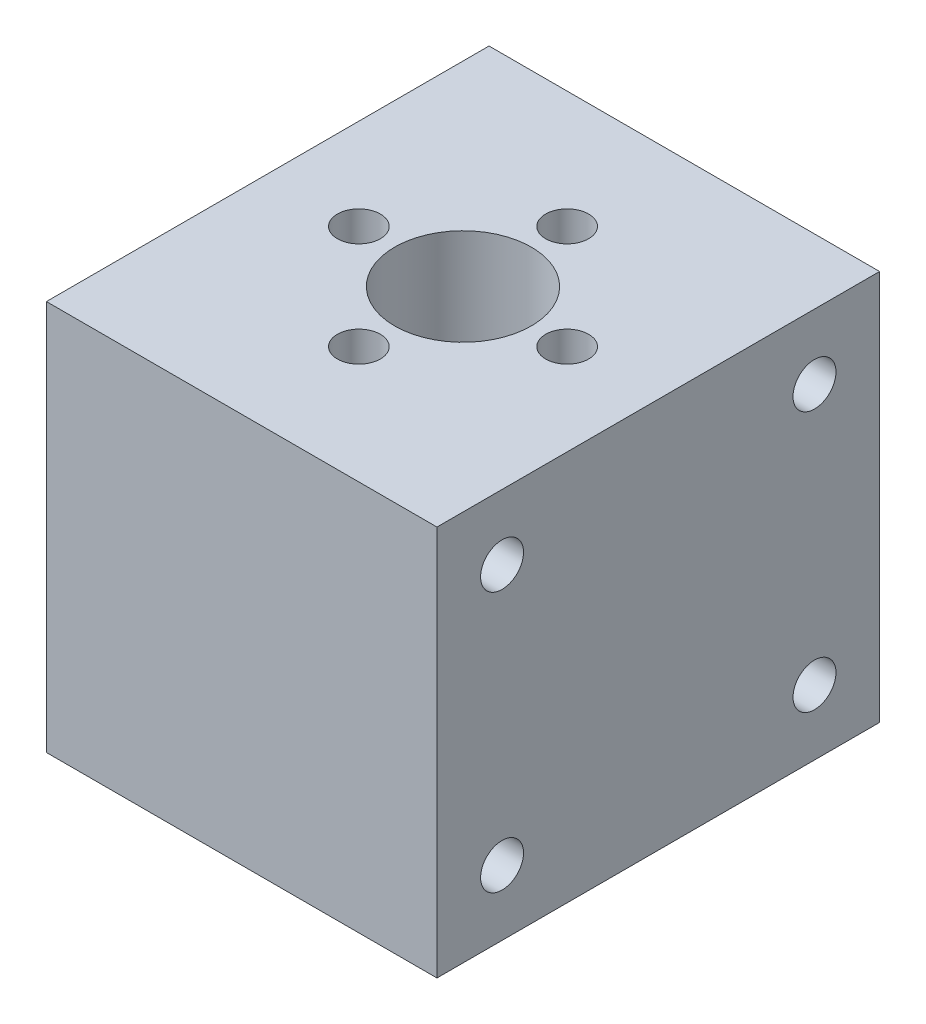
ISO-10303-21;
HEADER;
FILE_DESCRIPTION(('STEP AP214'),'2;1');
FILE_NAME('part.step','',(''),(''),'','','');
FILE_SCHEMA(('AUTOMOTIVE_DESIGN { 1 0 10303 214 1 1 1 1 }'));
ENDSEC;
DATA;
#1=APPLICATION_CONTEXT('core data for automotive mechanical design processes');
#2=APPLICATION_PROTOCOL_DEFINITION('international standard','automotive_design',2000,#1);
#3=PRODUCT_CONTEXT('',#1,'mechanical');
#4=PRODUCT('Part','Part','',(#3));
#5=PRODUCT_RELATED_PRODUCT_CATEGORY('part','',(#4));
#6=PRODUCT_DEFINITION_FORMATION('','',#4);
#7=PRODUCT_DEFINITION_CONTEXT('part definition',#1,'design');
#8=PRODUCT_DEFINITION('design','',#6,#7);
#9=PRODUCT_DEFINITION_SHAPE('','',#8);
#10=(LENGTH_UNIT() NAMED_UNIT(*) SI_UNIT(.MILLI.,.METRE.));
#11=(NAMED_UNIT(*) PLANE_ANGLE_UNIT() SI_UNIT($,.RADIAN.));
#12=(NAMED_UNIT(*) SI_UNIT($,.STERADIAN.) SOLID_ANGLE_UNIT());
#13=UNCERTAINTY_MEASURE_WITH_UNIT(LENGTH_MEASURE(1.E-05),#10,'distance_accuracy_value','');
#14=(GEOMETRIC_REPRESENTATION_CONTEXT(3) GLOBAL_UNCERTAINTY_ASSIGNED_CONTEXT((#13)) GLOBAL_UNIT_ASSIGNED_CONTEXT((#10,
#11,#12)) REPRESENTATION_CONTEXT('',''));
#15=CARTESIAN_POINT('',(0.,0.,0.));
#16=DIRECTION('',(0.,0.,1.));
#17=DIRECTION('',(1.,0.,0.));
#18=AXIS2_PLACEMENT_3D('',#15,#16,#17);
#19=CARTESIAN_POINT('',(0.,30.,0.));
#20=DIRECTION('',(1.,0.,0.));
#21=DIRECTION('',(0.,0.,-1.));
#22=AXIS2_PLACEMENT_3D('',#19,#20,#21);
#23=PLANE('',#22);
#24=DIRECTION('',(0.,0.,1.));
#25=VECTOR('',#24,1.);
#26=CARTESIAN_POINT('',(0.,0.,0.));
#27=LINE('',#26,#25);
#28=CARTESIAN_POINT('',(0.,0.,-34.));
#29=VERTEX_POINT('',#28);
#30=CARTESIAN_POINT('',(0.,0.,0.));
#31=VERTEX_POINT('',#30);
#32=EDGE_CURVE('E102',#29,#31,#27,.T.);
#33=ORIENTED_EDGE('',*,*,#32,.T.);
#34=DIRECTION('',(0.,-1.,0.));
#35=VECTOR('',#34,1.);
#36=CARTESIAN_POINT('',(0.,30.,0.));
#37=LINE('',#36,#35);
#38=CARTESIAN_POINT('',(0.,30.,0.));
#39=VERTEX_POINT('',#38);
#40=EDGE_CURVE('E11',#39,#31,#37,.T.);
#41=ORIENTED_EDGE('',*,*,#40,.F.);
#42=DIRECTION('',(0.,0.,1.));
#43=VECTOR('',#42,1.);
#44=CARTESIAN_POINT('',(0.,30.,0.));
#45=LINE('',#44,#43);
#46=CARTESIAN_POINT('',(0.,30.,-34.));
#47=VERTEX_POINT('',#46);
#48=EDGE_CURVE('E90',#47,#39,#45,.T.);
#49=ORIENTED_EDGE('',*,*,#48,.F.);
#50=DIRECTION('',(0.,-1.,0.));
#51=VECTOR('',#50,1.);
#52=CARTESIAN_POINT('',(0.,30.,-34.));
#53=LINE('',#52,#51);
#54=EDGE_CURVE('E98',#47,#29,#53,.T.);
#55=ORIENTED_EDGE('',*,*,#54,.T.);
#56=EDGE_LOOP('',(#33,#41,#49,#55));
#57=FACE_BOUND('',#56,.T.);
#58=ADVANCED_FACE('F39',(#57),#23,.F.);
#59=CARTESIAN_POINT('',(0.,30.,0.));
#60=DIRECTION('',(0.,0.,-1.));
#61=DIRECTION('',(-1.,0.,0.));
#62=AXIS2_PLACEMENT_3D('',#59,#60,#61);
#63=PLANE('',#62);
#64=DIRECTION('',(1.,0.,0.));
#65=VECTOR('',#64,1.);
#66=CARTESIAN_POINT('',(0.,0.,0.));
#67=LINE('',#66,#65);
#68=CARTESIAN_POINT('',(30.,0.,0.));
#69=VERTEX_POINT('',#68);
#70=EDGE_CURVE('E94',#31,#69,#67,.T.);
#71=ORIENTED_EDGE('',*,*,#70,.T.);
#72=DIRECTION('',(0.,-1.,0.));
#73=VECTOR('',#72,1.);
#74=CARTESIAN_POINT('',(30.,30.,0.));
#75=LINE('',#74,#73);
#76=CARTESIAN_POINT('',(30.,30.,0.));
#77=VERTEX_POINT('',#76);
#78=EDGE_CURVE('E47',#77,#69,#75,.T.);
#79=ORIENTED_EDGE('',*,*,#78,.F.);
#80=DIRECTION('',(1.,0.,0.));
#81=VECTOR('',#80,1.);
#82=CARTESIAN_POINT('',(0.,30.,0.));
#83=LINE('',#82,#81);
#84=EDGE_CURVE('E85',#39,#77,#83,.T.);
#85=ORIENTED_EDGE('',*,*,#84,.F.);
#86=ORIENTED_EDGE('',*,*,#40,.T.);
#87=EDGE_LOOP('',(#71,#79,#85,#86));
#88=FACE_BOUND('',#87,.T.);
#89=ADVANCED_FACE('F93',(#88),#63,.F.);
#90=CARTESIAN_POINT('',(30.,30.,0.));
#91=DIRECTION('',(-1.,0.,0.));
#92=DIRECTION('',(0.,0.,1.));
#93=AXIS2_PLACEMENT_3D('',#90,#91,#92);
#94=PLANE('',#93);
#95=CARTESIAN_POINT('',(30.,25.,-5.));
#96=DIRECTION('',(1.,0.,0.));
#97=DIRECTION('',(0.,0.,-1.));
#98=AXIS2_PLACEMENT_3D('',#95,#96,#97);
#99=CIRCLE('',#98,1.65000000000002);
#100=CARTESIAN_POINT('',(30.,25.,-6.65000000000002));
#101=VERTEX_POINT('',#100);
#102=EDGE_CURVE('E136',#101,#101,#99,.T.);
#103=ORIENTED_EDGE('',*,*,#102,.F.);
#104=EDGE_LOOP('',(#103));
#105=FACE_BOUND('',#104,.T.);
#106=CARTESIAN_POINT('',(30.,25.,-29.));
#107=DIRECTION('',(1.,0.,0.));
#108=DIRECTION('',(0.,0.,-1.));
#109=AXIS2_PLACEMENT_3D('',#106,#107,#108);
#110=CIRCLE('',#109,1.65000000000002);
#111=CARTESIAN_POINT('',(30.,25.,-30.65));
#112=VERTEX_POINT('',#111);
#113=EDGE_CURVE('E130',#112,#112,#110,.T.);
#114=ORIENTED_EDGE('',*,*,#113,.F.);
#115=EDGE_LOOP('',(#114));
#116=FACE_BOUND('',#115,.T.);
#117=CARTESIAN_POINT('',(30.,5.,-5.));
#118=DIRECTION('',(1.,0.,0.));
#119=DIRECTION('',(0.,0.,-1.));
#120=AXIS2_PLACEMENT_3D('',#117,#118,#119);
#121=CIRCLE('',#120,1.65000000000001);
#122=CARTESIAN_POINT('',(30.,5.,-6.65000000000001));
#123=VERTEX_POINT('',#122);
#124=EDGE_CURVE('E124',#123,#123,#121,.T.);
#125=ORIENTED_EDGE('',*,*,#124,.F.);
#126=EDGE_LOOP('',(#125));
#127=FACE_BOUND('',#126,.T.);
#128=CARTESIAN_POINT('',(30.,5.,-29.));
#129=DIRECTION('',(1.,0.,0.));
#130=DIRECTION('',(0.,0.,-1.));
#131=AXIS2_PLACEMENT_3D('',#128,#129,#130);
#132=CIRCLE('',#131,1.65000000000001);
#133=CARTESIAN_POINT('',(30.,5.,-30.65));
#134=VERTEX_POINT('',#133);
#135=EDGE_CURVE('E118',#134,#134,#132,.T.);
#136=ORIENTED_EDGE('',*,*,#135,.F.);
#137=EDGE_LOOP('',(#136));
#138=FACE_BOUND('',#137,.T.);
#139=DIRECTION('',(0.,0.,-1.));
#140=VECTOR('',#139,1.);
#141=CARTESIAN_POINT('',(30.,0.,0.));
#142=LINE('',#141,#140);
#143=CARTESIAN_POINT('',(30.,0.,-34.));
#144=VERTEX_POINT('',#143);
#145=EDGE_CURVE('E72',#69,#144,#142,.T.);
#146=ORIENTED_EDGE('',*,*,#145,.T.);
#147=DIRECTION('',(0.,-1.,0.));
#148=VECTOR('',#147,1.);
#149=CARTESIAN_POINT('',(30.,30.,-34.));
#150=LINE('',#149,#148);
#151=CARTESIAN_POINT('',(30.,30.,-34.));
#152=VERTEX_POINT('',#151);
#153=EDGE_CURVE('E95',#152,#144,#150,.T.);
#154=ORIENTED_EDGE('',*,*,#153,.F.);
#155=DIRECTION('',(0.,0.,-1.));
#156=VECTOR('',#155,1.);
#157=CARTESIAN_POINT('',(30.,30.,0.));
#158=LINE('',#157,#156);
#159=EDGE_CURVE('E88',#77,#152,#158,.T.);
#160=ORIENTED_EDGE('',*,*,#159,.F.);
#161=ORIENTED_EDGE('',*,*,#78,.T.);
#162=EDGE_LOOP('',(#146,#154,#160,#161));
#163=FACE_BOUND('',#162,.T.);
#164=ADVANCED_FACE('F96',(#105,#116,#127,#138,#163),#94,.F.);
#165=CARTESIAN_POINT('',(0.,30.,-34.));
#166=DIRECTION('',(0.,0.,1.));
#167=DIRECTION('',(1.,0.,0.));
#168=AXIS2_PLACEMENT_3D('',#165,#166,#167);
#169=PLANE('',#168);
#170=DIRECTION('',(-1.,0.,0.));
#171=VECTOR('',#170,1.);
#172=CARTESIAN_POINT('',(0.,0.,-34.));
#173=LINE('',#172,#171);
#174=EDGE_CURVE('E78',#144,#29,#173,.T.);
#175=ORIENTED_EDGE('',*,*,#174,.T.);
#176=ORIENTED_EDGE('',*,*,#54,.F.);
#177=DIRECTION('',(-1.,0.,0.));
#178=VECTOR('',#177,1.);
#179=CARTESIAN_POINT('',(0.,30.,-34.));
#180=LINE('',#179,#178);
#181=EDGE_CURVE('E55',#152,#47,#180,.T.);
#182=ORIENTED_EDGE('',*,*,#181,.F.);
#183=ORIENTED_EDGE('',*,*,#153,.T.);
#184=EDGE_LOOP('',(#175,#176,#182,#183));
#185=FACE_BOUND('',#184,.T.);
#186=ADVANCED_FACE('F110',(#185),#169,.F.);
#187=CARTESIAN_POINT('',(0.,30.,0.));
#188=DIRECTION('',(0.,-1.,0.));
#189=DIRECTION('',(0.,0.,-1.));
#190=AXIS2_PLACEMENT_3D('',#187,#188,#189);
#191=PLANE('',#190);
#192=CARTESIAN_POINT('',(15.,30.,-17.));
#193=DIRECTION('',(0.,1.,0.));
#194=DIRECTION('',(0.,0.,1.));
#195=AXIS2_PLACEMENT_3D('',#192,#193,#194);
#196=CIRCLE('',#195,5.25000000000001);
#197=CARTESIAN_POINT('',(15.,30.,-11.75));
#198=VERTEX_POINT('',#197);
#199=EDGE_CURVE('E166',#198,#198,#196,.T.);
#200=ORIENTED_EDGE('',*,*,#199,.F.);
#201=EDGE_LOOP('',(#200));
#202=FACE_BOUND('',#201,.T.);
#203=CARTESIAN_POINT('',(7.,30.,-17.));
#204=DIRECTION('',(0.,1.,0.));
#205=DIRECTION('',(0.,0.,1.));
#206=AXIS2_PLACEMENT_3D('',#203,#204,#205);
#207=CIRCLE('',#206,1.65000000000001);
#208=CARTESIAN_POINT('',(7.,30.,-15.35));
#209=VERTEX_POINT('',#208);
#210=EDGE_CURVE('E160',#209,#209,#207,.T.);
#211=ORIENTED_EDGE('',*,*,#210,.F.);
#212=EDGE_LOOP('',(#211));
#213=FACE_BOUND('',#212,.T.);
#214=CARTESIAN_POINT('',(15.,30.,-25.));
#215=DIRECTION('',(0.,1.,0.));
#216=DIRECTION('',(0.,0.,1.));
#217=AXIS2_PLACEMENT_3D('',#214,#215,#216);
#218=CIRCLE('',#217,1.65000000000001);
#219=CARTESIAN_POINT('',(15.,30.,-23.35));
#220=VERTEX_POINT('',#219);
#221=EDGE_CURVE('E154',#220,#220,#218,.T.);
#222=ORIENTED_EDGE('',*,*,#221,.F.);
#223=EDGE_LOOP('',(#222));
#224=FACE_BOUND('',#223,.T.);
#225=CARTESIAN_POINT('',(23.,30.,-17.));
#226=DIRECTION('',(0.,1.,0.));
#227=DIRECTION('',(0.,0.,1.));
#228=AXIS2_PLACEMENT_3D('',#225,#226,#227);
#229=CIRCLE('',#228,1.65000000000001);
#230=CARTESIAN_POINT('',(23.,30.,-15.35));
#231=VERTEX_POINT('',#230);
#232=EDGE_CURVE('E148',#231,#231,#229,.T.);
#233=ORIENTED_EDGE('',*,*,#232,.F.);
#234=EDGE_LOOP('',(#233));
#235=FACE_BOUND('',#234,.T.);
#236=CARTESIAN_POINT('',(15.,30.,-9.00000000000001));
#237=DIRECTION('',(0.,1.,0.));
#238=DIRECTION('',(0.,0.,1.));
#239=AXIS2_PLACEMENT_3D('',#236,#237,#238);
#240=CIRCLE('',#239,1.65000000000001);
#241=CARTESIAN_POINT('',(15.,30.,-7.34999999999999));
#242=VERTEX_POINT('',#241);
#243=EDGE_CURVE('E142',#242,#242,#240,.T.);
#244=ORIENTED_EDGE('',*,*,#243,.F.);
#245=EDGE_LOOP('',(#244));
#246=FACE_BOUND('',#245,.T.);
#247=ORIENTED_EDGE('',*,*,#48,.T.);
#248=ORIENTED_EDGE('',*,*,#84,.T.);
#249=ORIENTED_EDGE('',*,*,#159,.T.);
#250=ORIENTED_EDGE('',*,*,#181,.T.);
#251=EDGE_LOOP('',(#247,#248,#249,#250));
#252=FACE_BOUND('',#251,.T.);
#253=ADVANCED_FACE('F86',(#202,#213,#224,#235,#246,#252),#191,.F.);
#254=CARTESIAN_POINT('',(0.,0.,0.));
#255=DIRECTION('',(0.,-1.,0.));
#256=DIRECTION('',(0.,0.,-1.));
#257=AXIS2_PLACEMENT_3D('',#254,#255,#256);
#258=PLANE('',#257);
#259=CARTESIAN_POINT('',(15.,0.,-17.));
#260=DIRECTION('',(0.,-1.,0.));
#261=DIRECTION('',(0.,0.,-1.));
#262=AXIS2_PLACEMENT_3D('',#259,#260,#261);
#263=CIRCLE('',#262,5.25000000000001);
#264=CARTESIAN_POINT('',(15.,0.,-22.25));
#265=VERTEX_POINT('',#264);
#266=EDGE_CURVE('E163',#265,#265,#263,.T.);
#267=ORIENTED_EDGE('',*,*,#266,.F.);
#268=EDGE_LOOP('',(#267));
#269=FACE_BOUND('',#268,.T.);
#270=ORIENTED_EDGE('',*,*,#32,.F.);
#271=ORIENTED_EDGE('',*,*,#174,.F.);
#272=ORIENTED_EDGE('',*,*,#145,.F.);
#273=ORIENTED_EDGE('',*,*,#70,.F.);
#274=EDGE_LOOP('',(#270,#271,#272,#273));
#275=FACE_BOUND('',#274,.T.);
#276=ADVANCED_FACE('F113',(#269,#275),#258,.T.);
#277=CARTESIAN_POINT('',(20.,5.,-29.));
#278=DIRECTION('',(-1.,0.,0.));
#279=DIRECTION('',(0.,0.,1.));
#280=AXIS2_PLACEMENT_3D('',#277,#278,#279);
#281=PLANE('',#280);
#282=CARTESIAN_POINT('',(20.,5.,-29.));
#283=DIRECTION('',(1.,0.,0.));
#284=DIRECTION('',(0.,0.,-1.));
#285=AXIS2_PLACEMENT_3D('',#282,#283,#284);
#286=CIRCLE('',#285,1.65000000000001);
#287=CARTESIAN_POINT('',(20.,5.,-30.65));
#288=VERTEX_POINT('',#287);
#289=EDGE_CURVE('E105',#288,#288,#286,.T.);
#290=ORIENTED_EDGE('',*,*,#289,.T.);
#291=EDGE_LOOP('',(#290));
#292=FACE_BOUND('',#291,.T.);
#293=ADVANCED_FACE('F214',(#292),#281,.F.);
#294=CARTESIAN_POINT('',(30.,5.,-29.));
#295=DIRECTION('',(1.,0.,0.));
#296=DIRECTION('',(0.,0.,-1.));
#297=AXIS2_PLACEMENT_3D('',#294,#295,#296);
#298=CYLINDRICAL_SURFACE('',#297,1.65000000000001);
#299=ORIENTED_EDGE('',*,*,#289,.F.);
#300=EDGE_LOOP('',(#299));
#301=FACE_BOUND('',#300,.T.);
#302=ORIENTED_EDGE('',*,*,#135,.T.);
#303=EDGE_LOOP('',(#302));
#304=FACE_BOUND('',#303,.T.);
#305=ADVANCED_FACE('F219',(#301,#304),#298,.F.);
#306=CARTESIAN_POINT('',(20.,5.,-5.));
#307=DIRECTION('',(-1.,0.,0.));
#308=DIRECTION('',(0.,0.,1.));
#309=AXIS2_PLACEMENT_3D('',#306,#307,#308);
#310=PLANE('',#309);
#311=CARTESIAN_POINT('',(20.,5.,-5.));
#312=DIRECTION('',(1.,0.,0.));
#313=DIRECTION('',(0.,0.,-1.));
#314=AXIS2_PLACEMENT_3D('',#311,#312,#313);
#315=CIRCLE('',#314,1.65000000000001);
#316=CARTESIAN_POINT('',(20.,5.,-6.65000000000001));
#317=VERTEX_POINT('',#316);
#318=EDGE_CURVE('E121',#317,#317,#315,.T.);
#319=ORIENTED_EDGE('',*,*,#318,.T.);
#320=EDGE_LOOP('',(#319));
#321=FACE_BOUND('',#320,.T.);
#322=ADVANCED_FACE('F223',(#321),#310,.F.);
#323=CARTESIAN_POINT('',(30.,5.,-5.));
#324=DIRECTION('',(1.,0.,0.));
#325=DIRECTION('',(0.,0.,-1.));
#326=AXIS2_PLACEMENT_3D('',#323,#324,#325);
#327=CYLINDRICAL_SURFACE('',#326,1.65000000000001);
#328=ORIENTED_EDGE('',*,*,#318,.F.);
#329=EDGE_LOOP('',(#328));
#330=FACE_BOUND('',#329,.T.);
#331=ORIENTED_EDGE('',*,*,#124,.T.);
#332=EDGE_LOOP('',(#331));
#333=FACE_BOUND('',#332,.T.);
#334=ADVANCED_FACE('F227',(#330,#333),#327,.F.);
#335=CARTESIAN_POINT('',(20.,25.,-29.));
#336=DIRECTION('',(-1.,0.,0.));
#337=DIRECTION('',(0.,0.,1.));
#338=AXIS2_PLACEMENT_3D('',#335,#336,#337);
#339=PLANE('',#338);
#340=CARTESIAN_POINT('',(20.,25.,-29.));
#341=DIRECTION('',(1.,0.,0.));
#342=DIRECTION('',(0.,0.,-1.));
#343=AXIS2_PLACEMENT_3D('',#340,#341,#342);
#344=CIRCLE('',#343,1.65000000000001);
#345=CARTESIAN_POINT('',(20.,25.,-30.65));
#346=VERTEX_POINT('',#345);
#347=EDGE_CURVE('E127',#346,#346,#344,.T.);
#348=ORIENTED_EDGE('',*,*,#347,.T.);
#349=EDGE_LOOP('',(#348));
#350=FACE_BOUND('',#349,.T.);
#351=ADVANCED_FACE('F231',(#350),#339,.F.);
#352=CARTESIAN_POINT('',(30.,25.,-29.));
#353=DIRECTION('',(1.,0.,0.));
#354=DIRECTION('',(0.,0.,-1.));
#355=AXIS2_PLACEMENT_3D('',#352,#353,#354);
#356=CYLINDRICAL_SURFACE('',#355,1.65000000000001);
#357=ORIENTED_EDGE('',*,*,#347,.F.);
#358=EDGE_LOOP('',(#357));
#359=FACE_BOUND('',#358,.T.);
#360=ORIENTED_EDGE('',*,*,#113,.T.);
#361=EDGE_LOOP('',(#360));
#362=FACE_BOUND('',#361,.T.);
#363=ADVANCED_FACE('F235',(#359,#362),#356,.F.);
#364=CARTESIAN_POINT('',(20.,25.,-5.));
#365=DIRECTION('',(-1.,0.,0.));
#366=DIRECTION('',(0.,0.,1.));
#367=AXIS2_PLACEMENT_3D('',#364,#365,#366);
#368=PLANE('',#367);
#369=CARTESIAN_POINT('',(20.,25.,-5.));
#370=DIRECTION('',(1.,0.,0.));
#371=DIRECTION('',(0.,0.,-1.));
#372=AXIS2_PLACEMENT_3D('',#369,#370,#371);
#373=CIRCLE('',#372,1.65000000000001);
#374=CARTESIAN_POINT('',(20.,25.,-6.65000000000001));
#375=VERTEX_POINT('',#374);
#376=EDGE_CURVE('E133',#375,#375,#373,.T.);
#377=ORIENTED_EDGE('',*,*,#376,.T.);
#378=EDGE_LOOP('',(#377));
#379=FACE_BOUND('',#378,.T.);
#380=ADVANCED_FACE('F239',(#379),#368,.F.);
#381=CARTESIAN_POINT('',(30.,25.,-5.));
#382=DIRECTION('',(1.,0.,0.));
#383=DIRECTION('',(0.,0.,-1.));
#384=AXIS2_PLACEMENT_3D('',#381,#382,#383);
#385=CYLINDRICAL_SURFACE('',#384,1.65000000000001);
#386=ORIENTED_EDGE('',*,*,#376,.F.);
#387=EDGE_LOOP('',(#386));
#388=FACE_BOUND('',#387,.T.);
#389=ORIENTED_EDGE('',*,*,#102,.T.);
#390=EDGE_LOOP('',(#389));
#391=FACE_BOUND('',#390,.T.);
#392=ADVANCED_FACE('F197',(#388,#391),#385,.F.);
#393=CARTESIAN_POINT('',(15.,20.,-9.00000000000001));
#394=DIRECTION('',(0.,-1.,0.));
#395=DIRECTION('',(0.,0.,-1.));
#396=AXIS2_PLACEMENT_3D('',#393,#394,#395);
#397=PLANE('',#396);
#398=CARTESIAN_POINT('',(15.,20.,-9.00000000000001));
#399=DIRECTION('',(0.,1.,0.));
#400=DIRECTION('',(0.,0.,1.));
#401=AXIS2_PLACEMENT_3D('',#398,#399,#400);
#402=CIRCLE('',#401,1.65000000000001);
#403=CARTESIAN_POINT('',(15.,20.,-7.34999999999999));
#404=VERTEX_POINT('',#403);
#405=EDGE_CURVE('E139',#404,#404,#402,.T.);
#406=ORIENTED_EDGE('',*,*,#405,.T.);
#407=EDGE_LOOP('',(#406));
#408=FACE_BOUND('',#407,.T.);
#409=ADVANCED_FACE('F187',(#408),#397,.F.);
#410=CARTESIAN_POINT('',(15.,30.,-9.00000000000001));
#411=DIRECTION('',(0.,1.,0.));
#412=DIRECTION('',(0.,0.,1.));
#413=AXIS2_PLACEMENT_3D('',#410,#411,#412);
#414=CYLINDRICAL_SURFACE('',#413,1.65000000000001);
#415=ORIENTED_EDGE('',*,*,#405,.F.);
#416=EDGE_LOOP('',(#415));
#417=FACE_BOUND('',#416,.T.);
#418=ORIENTED_EDGE('',*,*,#243,.T.);
#419=EDGE_LOOP('',(#418));
#420=FACE_BOUND('',#419,.T.);
#421=ADVANCED_FACE('F184',(#417,#420),#414,.F.);
#422=CARTESIAN_POINT('',(23.,20.,-17.));
#423=DIRECTION('',(0.,-1.,0.));
#424=DIRECTION('',(0.,0.,-1.));
#425=AXIS2_PLACEMENT_3D('',#422,#423,#424);
#426=PLANE('',#425);
#427=CARTESIAN_POINT('',(23.,20.,-17.));
#428=DIRECTION('',(0.,1.,0.));
#429=DIRECTION('',(0.,0.,1.));
#430=AXIS2_PLACEMENT_3D('',#427,#428,#429);
#431=CIRCLE('',#430,1.65000000000001);
#432=CARTESIAN_POINT('',(23.,20.,-15.35));
#433=VERTEX_POINT('',#432);
#434=EDGE_CURVE('E145',#433,#433,#431,.T.);
#435=ORIENTED_EDGE('',*,*,#434,.T.);
#436=EDGE_LOOP('',(#435));
#437=FACE_BOUND('',#436,.T.);
#438=ADVANCED_FACE('F186',(#437),#426,.F.);
#439=CARTESIAN_POINT('',(23.,30.,-17.));
#440=DIRECTION('',(0.,1.,0.));
#441=DIRECTION('',(0.,0.,1.));
#442=AXIS2_PLACEMENT_3D('',#439,#440,#441);
#443=CYLINDRICAL_SURFACE('',#442,1.65000000000001);
#444=ORIENTED_EDGE('',*,*,#434,.F.);
#445=EDGE_LOOP('',(#444));
#446=FACE_BOUND('',#445,.T.);
#447=ORIENTED_EDGE('',*,*,#232,.T.);
#448=EDGE_LOOP('',(#447));
#449=FACE_BOUND('',#448,.T.);
#450=ADVANCED_FACE('F194',(#446,#449),#443,.F.);
#451=CARTESIAN_POINT('',(15.,20.,-25.));
#452=DIRECTION('',(0.,-1.,0.));
#453=DIRECTION('',(0.,0.,-1.));
#454=AXIS2_PLACEMENT_3D('',#451,#452,#453);
#455=PLANE('',#454);
#456=CARTESIAN_POINT('',(15.,20.,-25.));
#457=DIRECTION('',(0.,1.,0.));
#458=DIRECTION('',(0.,0.,1.));
#459=AXIS2_PLACEMENT_3D('',#456,#457,#458);
#460=CIRCLE('',#459,1.65000000000001);
#461=CARTESIAN_POINT('',(15.,20.,-23.35));
#462=VERTEX_POINT('',#461);
#463=EDGE_CURVE('E151',#462,#462,#460,.T.);
#464=ORIENTED_EDGE('',*,*,#463,.T.);
#465=EDGE_LOOP('',(#464));
#466=FACE_BOUND('',#465,.T.);
#467=ADVANCED_FACE('F287',(#466),#455,.F.);
#468=CARTESIAN_POINT('',(15.,30.,-25.));
#469=DIRECTION('',(0.,1.,0.));
#470=DIRECTION('',(0.,0.,1.));
#471=AXIS2_PLACEMENT_3D('',#468,#469,#470);
#472=CYLINDRICAL_SURFACE('',#471,1.65000000000001);
#473=ORIENTED_EDGE('',*,*,#463,.F.);
#474=EDGE_LOOP('',(#473));
#475=FACE_BOUND('',#474,.T.);
#476=ORIENTED_EDGE('',*,*,#221,.T.);
#477=EDGE_LOOP('',(#476));
#478=FACE_BOUND('',#477,.T.);
#479=ADVANCED_FACE('F297',(#475,#478),#472,.F.);
#480=CARTESIAN_POINT('',(7.,20.,-17.));
#481=DIRECTION('',(0.,-1.,0.));
#482=DIRECTION('',(0.,0.,-1.));
#483=AXIS2_PLACEMENT_3D('',#480,#481,#482);
#484=PLANE('',#483);
#485=CARTESIAN_POINT('',(7.,20.,-17.));
#486=DIRECTION('',(0.,1.,0.));
#487=DIRECTION('',(0.,0.,1.));
#488=AXIS2_PLACEMENT_3D('',#485,#486,#487);
#489=CIRCLE('',#488,1.65000000000001);
#490=CARTESIAN_POINT('',(7.,20.,-15.35));
#491=VERTEX_POINT('',#490);
#492=EDGE_CURVE('E157',#491,#491,#489,.T.);
#493=ORIENTED_EDGE('',*,*,#492,.T.);
#494=EDGE_LOOP('',(#493));
#495=FACE_BOUND('',#494,.T.);
#496=ADVANCED_FACE('F307',(#495),#484,.F.);
#497=CARTESIAN_POINT('',(7.,30.,-17.));
#498=DIRECTION('',(0.,1.,0.));
#499=DIRECTION('',(0.,0.,1.));
#500=AXIS2_PLACEMENT_3D('',#497,#498,#499);
#501=CYLINDRICAL_SURFACE('',#500,1.65000000000001);
#502=ORIENTED_EDGE('',*,*,#492,.F.);
#503=EDGE_LOOP('',(#502));
#504=FACE_BOUND('',#503,.T.);
#505=ORIENTED_EDGE('',*,*,#210,.T.);
#506=EDGE_LOOP('',(#505));
#507=FACE_BOUND('',#506,.T.);
#508=ADVANCED_FACE('F317',(#504,#507),#501,.F.);
#509=CARTESIAN_POINT('',(15.,30.,-17.));
#510=DIRECTION('',(0.,1.,0.));
#511=DIRECTION('',(0.,0.,1.));
#512=AXIS2_PLACEMENT_3D('',#509,#510,#511);
#513=CYLINDRICAL_SURFACE('',#512,5.25000000000001);
#514=ORIENTED_EDGE('',*,*,#199,.T.);
#515=EDGE_LOOP('',(#514));
#516=FACE_BOUND('',#515,.T.);
#517=ORIENTED_EDGE('',*,*,#266,.T.);
#518=EDGE_LOOP('',(#517));
#519=FACE_BOUND('',#518,.T.);
#520=ADVANCED_FACE('F170',(#516,#519),#513,.F.);
#521=CLOSED_SHELL('',(#58,#89,#164,#186,#253,#276,#293,#305,#322,#334,#351,#363,#380,#392,#409,
#421,#438,#450,#467,#479,#496,#508,#520));
#522=MANIFOLD_SOLID_BREP('B2',#521);
#523=ADVANCED_BREP_SHAPE_REPRESENTATION('',(#18,#522),#14);
#524=SHAPE_DEFINITION_REPRESENTATION(#9,#523);
ENDSEC;
END-ISO-10303-21;
